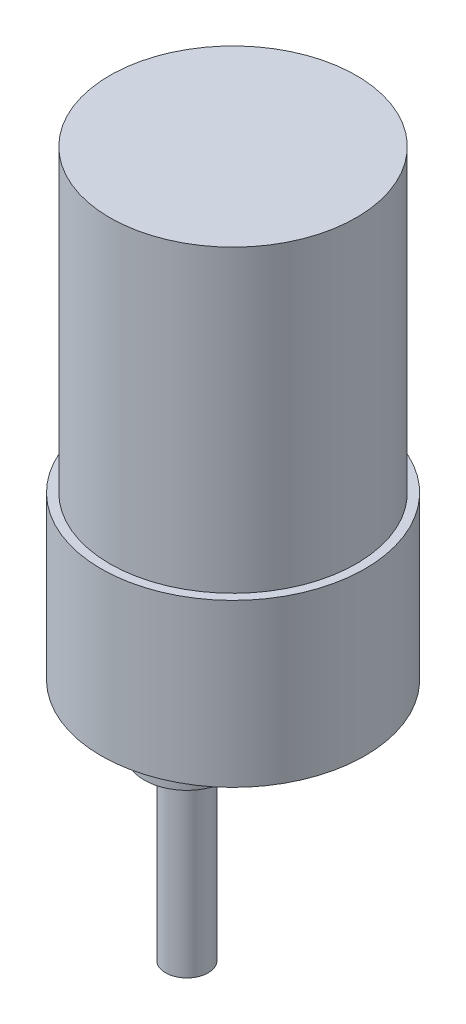
ISO-10303-21;
HEADER;
FILE_DESCRIPTION(('STEP AP214'),'2;1');
FILE_NAME('part.step','',(''),(''),'','','');
FILE_SCHEMA(('AUTOMOTIVE_DESIGN { 1 0 10303 214 1 1 1 1 }'));
ENDSEC;
DATA;
#1=APPLICATION_CONTEXT('core data for automotive mechanical design processes');
#2=APPLICATION_PROTOCOL_DEFINITION('international standard','automotive_design',2000,#1);
#3=PRODUCT_CONTEXT('',#1,'mechanical');
#4=PRODUCT('Part','Part','',(#3));
#5=PRODUCT_RELATED_PRODUCT_CATEGORY('part','',(#4));
#6=PRODUCT_DEFINITION_FORMATION('','',#4);
#7=PRODUCT_DEFINITION_CONTEXT('part definition',#1,'design');
#8=PRODUCT_DEFINITION('design','',#6,#7);
#9=PRODUCT_DEFINITION_SHAPE('','',#8);
#10=(LENGTH_UNIT() NAMED_UNIT(*) SI_UNIT(.MILLI.,.METRE.));
#11=(NAMED_UNIT(*) PLANE_ANGLE_UNIT() SI_UNIT($,.RADIAN.));
#12=(NAMED_UNIT(*) SI_UNIT($,.STERADIAN.) SOLID_ANGLE_UNIT());
#13=UNCERTAINTY_MEASURE_WITH_UNIT(LENGTH_MEASURE(1.E-05),#10,'distance_accuracy_value','');
#14=(GEOMETRIC_REPRESENTATION_CONTEXT(3) GLOBAL_UNCERTAINTY_ASSIGNED_CONTEXT((#13)) GLOBAL_UNIT_ASSIGNED_CONTEXT((#10,
#11,#12)) REPRESENTATION_CONTEXT('',''));
#15=CARTESIAN_POINT('',(0.,0.,0.));
#16=DIRECTION('',(0.,0.,1.));
#17=DIRECTION('',(1.,0.,0.));
#18=AXIS2_PLACEMENT_3D('',#15,#16,#17);
#19=CARTESIAN_POINT('',(0.,0.,0.));
#20=DIRECTION('',(0.,1.,0.));
#21=DIRECTION('',(0.,0.,1.));
#22=AXIS2_PLACEMENT_3D('',#19,#20,#21);
#23=PLANE('',#22);
#24=CARTESIAN_POINT('',(14.,0.,0.));
#25=DIRECTION('',(0.,-1.,0.));
#26=DIRECTION('',(0.,0.,-1.));
#27=AXIS2_PLACEMENT_3D('',#24,#25,#26);
#28=CIRCLE('',#27,1.);
#29=CARTESIAN_POINT('',(14.,0.,-1.));
#30=VERTEX_POINT('',#29);
#31=EDGE_CURVE('E72',#30,#30,#28,.T.);
#32=ORIENTED_EDGE('',*,*,#31,.F.);
#33=EDGE_LOOP('',(#32));
#34=FACE_BOUND('',#33,.T.);
#35=CARTESIAN_POINT('',(0.,0.,6.5));
#36=DIRECTION('',(0.,1.,0.));
#37=DIRECTION('',(0.,0.,1.));
#38=AXIS2_PLACEMENT_3D('',#35,#36,#37);
#39=CIRCLE('',#38,6.);
#40=CARTESIAN_POINT('',(0.,0.,12.5));
#41=VERTEX_POINT('',#40);
#42=EDGE_CURVE('E10',#41,#41,#39,.F.);
#43=ORIENTED_EDGE('',*,*,#42,.F.);
#44=EDGE_LOOP('',(#43));
#45=FACE_BOUND('',#44,.T.);
#46=CARTESIAN_POINT('',(0.,0.,0.));
#47=DIRECTION('',(0.,1.,0.));
#48=DIRECTION('',(0.,0.,1.));
#49=AXIS2_PLACEMENT_3D('',#46,#47,#48);
#50=CIRCLE('',#49,18.575);
#51=CARTESIAN_POINT('',(0.,0.,18.575));
#52=VERTEX_POINT('',#51);
#53=EDGE_CURVE('E44',#52,#52,#50,.T.);
#54=ORIENTED_EDGE('',*,*,#53,.F.);
#55=EDGE_LOOP('',(#54));
#56=FACE_BOUND('',#55,.T.);
#57=CARTESIAN_POINT('',(-14.,0.,0.));
#58=DIRECTION('',(0.,-1.,0.));
#59=DIRECTION('',(0.,0.,-1.));
#60=AXIS2_PLACEMENT_3D('',#57,#58,#59);
#61=CIRCLE('',#60,1.);
#62=CARTESIAN_POINT('',(-14.,0.,-1.));
#63=VERTEX_POINT('',#62);
#64=EDGE_CURVE('E66',#63,#63,#61,.F.);
#65=ORIENTED_EDGE('',*,*,#64,.T.);
#66=EDGE_LOOP('',(#65));
#67=FACE_BOUND('',#66,.T.);
#68=ADVANCED_FACE('F33',(#34,#45,#56,#67),#23,.F.);
#69=CARTESIAN_POINT('',(0.,22.8,0.));
#70=DIRECTION('',(0.,1.,0.));
#71=DIRECTION('',(0.,0.,1.));
#72=AXIS2_PLACEMENT_3D('',#69,#70,#71);
#73=PLANE('',#72);
#74=CARTESIAN_POINT('',(0.,22.8,0.));
#75=DIRECTION('',(0.,1.,0.));
#76=DIRECTION('',(0.,0.,1.));
#77=AXIS2_PLACEMENT_3D('',#74,#75,#76);
#78=CIRCLE('',#77,18.575);
#79=CARTESIAN_POINT('',(0.,22.8,18.575));
#80=VERTEX_POINT('',#79);
#81=EDGE_CURVE('E40',#80,#80,#78,.T.);
#82=ORIENTED_EDGE('',*,*,#81,.T.);
#83=EDGE_LOOP('',(#82));
#84=FACE_BOUND('',#83,.T.);
#85=CARTESIAN_POINT('',(0.,22.8,0.));
#86=DIRECTION('',(0.,1.,0.));
#87=DIRECTION('',(0.,0.,1.));
#88=AXIS2_PLACEMENT_3D('',#85,#86,#87);
#89=CIRCLE('',#88,17.35);
#90=CARTESIAN_POINT('',(0.,22.8,17.35));
#91=VERTEX_POINT('',#90);
#92=EDGE_CURVE('E49',#91,#91,#89,.F.);
#93=ORIENTED_EDGE('',*,*,#92,.T.);
#94=EDGE_LOOP('',(#93));
#95=FACE_BOUND('',#94,.T.);
#96=ADVANCED_FACE('F89',(#84,#95),#73,.T.);
#97=CARTESIAN_POINT('',(0.,22.8,0.));
#98=DIRECTION('',(0.,-1.,0.));
#99=DIRECTION('',(0.,0.,-1.));
#100=AXIS2_PLACEMENT_3D('',#97,#98,#99);
#101=CYLINDRICAL_SURFACE('',#100,18.575);
#102=ORIENTED_EDGE('',*,*,#81,.F.);
#103=EDGE_LOOP('',(#102));
#104=FACE_BOUND('',#103,.T.);
#105=ORIENTED_EDGE('',*,*,#53,.T.);
#106=EDGE_LOOP('',(#105));
#107=FACE_BOUND('',#106,.T.);
#108=ADVANCED_FACE('F35',(#104,#107),#101,.T.);
#109=CARTESIAN_POINT('',(0.,65.,0.));
#110=DIRECTION('',(0.,-1.,0.));
#111=DIRECTION('',(0.,0.,-1.));
#112=AXIS2_PLACEMENT_3D('',#109,#110,#111);
#113=CYLINDRICAL_SURFACE('',#112,17.35);
#114=ORIENTED_EDGE('',*,*,#92,.F.);
#115=EDGE_LOOP('',(#114));
#116=FACE_BOUND('',#115,.T.);
#117=CARTESIAN_POINT('',(0.,65.,0.));
#118=DIRECTION('',(0.,1.,0.));
#119=DIRECTION('',(0.,0.,1.));
#120=AXIS2_PLACEMENT_3D('',#117,#118,#119);
#121=CIRCLE('',#120,17.35);
#122=CARTESIAN_POINT('',(0.,65.,17.35));
#123=VERTEX_POINT('',#122);
#124=EDGE_CURVE('E53',#123,#123,#121,.T.);
#125=ORIENTED_EDGE('',*,*,#124,.F.);
#126=EDGE_LOOP('',(#125));
#127=FACE_BOUND('',#126,.T.);
#128=ADVANCED_FACE('F124',(#116,#127),#113,.T.);
#129=CARTESIAN_POINT('',(0.,65.,0.));
#130=DIRECTION('',(0.,1.,0.));
#131=DIRECTION('',(0.,0.,1.));
#132=AXIS2_PLACEMENT_3D('',#129,#130,#131);
#133=PLANE('',#132);
#134=ORIENTED_EDGE('',*,*,#124,.T.);
#135=EDGE_LOOP('',(#134));
#136=FACE_BOUND('',#135,.T.);
#137=ADVANCED_FACE('F120',(#136),#133,.T.);
#138=CARTESIAN_POINT('',(0.,-6.,6.5));
#139=DIRECTION('',(0.,1.,0.));
#140=DIRECTION('',(0.,0.,1.));
#141=AXIS2_PLACEMENT_3D('',#138,#139,#140);
#142=CYLINDRICAL_SURFACE('',#141,6.);
#143=CARTESIAN_POINT('',(0.,-6.,6.5));
#144=DIRECTION('',(0.,-1.,0.));
#145=DIRECTION('',(0.,0.,-1.));
#146=AXIS2_PLACEMENT_3D('',#143,#144,#145);
#147=CIRCLE('',#146,6.);
#148=CARTESIAN_POINT('',(0.,-6.,0.499999999999999));
#149=VERTEX_POINT('',#148);
#150=EDGE_CURVE('E56',#149,#149,#147,.T.);
#151=ORIENTED_EDGE('',*,*,#150,.F.);
#152=EDGE_LOOP('',(#151));
#153=FACE_BOUND('',#152,.T.);
#154=ORIENTED_EDGE('',*,*,#42,.T.);
#155=EDGE_LOOP('',(#154));
#156=FACE_BOUND('',#155,.T.);
#157=ADVANCED_FACE('F116',(#153,#156),#142,.T.);
#158=CARTESIAN_POINT('',(0.,-6.,0.));
#159=DIRECTION('',(0.,-1.,0.));
#160=DIRECTION('',(0.,0.,-1.));
#161=AXIS2_PLACEMENT_3D('',#158,#159,#160);
#162=PLANE('',#161);
#163=CARTESIAN_POINT('',(0.,-6.,6.5));
#164=DIRECTION('',(0.,-1.,0.));
#165=DIRECTION('',(0.,0.,-1.));
#166=AXIS2_PLACEMENT_3D('',#163,#164,#165);
#167=CIRCLE('',#166,3.);
#168=CARTESIAN_POINT('',(0.,-6.,3.5));
#169=VERTEX_POINT('',#168);
#170=EDGE_CURVE('E59',#169,#169,#167,.T.);
#171=ORIENTED_EDGE('',*,*,#170,.F.);
#172=EDGE_LOOP('',(#171));
#173=FACE_BOUND('',#172,.T.);
#174=ORIENTED_EDGE('',*,*,#150,.T.);
#175=EDGE_LOOP('',(#174));
#176=FACE_BOUND('',#175,.T.);
#177=ADVANCED_FACE('F112',(#173,#176),#162,.T.);
#178=CARTESIAN_POINT('',(0.,-31.,6.5));
#179=DIRECTION('',(0.,1.,0.));
#180=DIRECTION('',(0.,0.,1.));
#181=AXIS2_PLACEMENT_3D('',#178,#179,#180);
#182=CYLINDRICAL_SURFACE('',#181,3.);
#183=ORIENTED_EDGE('',*,*,#170,.T.);
#184=EDGE_LOOP('',(#183));
#185=FACE_BOUND('',#184,.T.);
#186=CARTESIAN_POINT('',(0.,-31.,6.5));
#187=DIRECTION('',(0.,-1.,0.));
#188=DIRECTION('',(0.,0.,-1.));
#189=AXIS2_PLACEMENT_3D('',#186,#187,#188);
#190=CIRCLE('',#189,3.);
#191=CARTESIAN_POINT('',(0.,-31.,3.5));
#192=VERTEX_POINT('',#191);
#193=EDGE_CURVE('E62',#192,#192,#190,.T.);
#194=ORIENTED_EDGE('',*,*,#193,.F.);
#195=EDGE_LOOP('',(#194));
#196=FACE_BOUND('',#195,.T.);
#197=ADVANCED_FACE('F106',(#185,#196),#182,.T.);
#198=CARTESIAN_POINT('',(0.,-31.,0.));
#199=DIRECTION('',(0.,-1.,0.));
#200=DIRECTION('',(0.,0.,-1.));
#201=AXIS2_PLACEMENT_3D('',#198,#199,#200);
#202=PLANE('',#201);
#203=ORIENTED_EDGE('',*,*,#193,.T.);
#204=EDGE_LOOP('',(#203));
#205=FACE_BOUND('',#204,.T.);
#206=ADVANCED_FACE('F97',(#205),#202,.T.);
#207=CARTESIAN_POINT('',(-14.,5.,0.));
#208=DIRECTION('',(0.,-1.,0.));
#209=DIRECTION('',(0.,0.,-1.));
#210=AXIS2_PLACEMENT_3D('',#207,#208,#209);
#211=CYLINDRICAL_SURFACE('',#210,1.);
#212=CARTESIAN_POINT('',(-14.,5.,0.));
#213=DIRECTION('',(0.,-1.,0.));
#214=DIRECTION('',(0.,0.,-1.));
#215=AXIS2_PLACEMENT_3D('',#212,#213,#214);
#216=CIRCLE('',#215,1.);
#217=CARTESIAN_POINT('',(-14.,5.,-1.));
#218=VERTEX_POINT('',#217);
#219=EDGE_CURVE('E65',#218,#218,#216,.F.);
#220=ORIENTED_EDGE('',*,*,#219,.T.);
#221=EDGE_LOOP('',(#220));
#222=FACE_BOUND('',#221,.T.);
#223=ORIENTED_EDGE('',*,*,#64,.F.);
#224=EDGE_LOOP('',(#223));
#225=FACE_BOUND('',#224,.T.);
#226=ADVANCED_FACE('F95',(#222,#225),#211,.F.);
#227=CARTESIAN_POINT('',(0.,5.,0.));
#228=DIRECTION('',(0.,-1.,0.));
#229=DIRECTION('',(0.,0.,-1.));
#230=AXIS2_PLACEMENT_3D('',#227,#228,#229);
#231=PLANE('',#230);
#232=ORIENTED_EDGE('',*,*,#219,.F.);
#233=EDGE_LOOP('',(#232));
#234=FACE_BOUND('',#233,.T.);
#235=ADVANCED_FACE('F83',(#234),#231,.T.);
#236=CARTESIAN_POINT('',(14.,5.,0.));
#237=DIRECTION('',(0.,-1.,0.));
#238=DIRECTION('',(0.,0.,-1.));
#239=AXIS2_PLACEMENT_3D('',#236,#237,#238);
#240=CYLINDRICAL_SURFACE('',#239,1.);
#241=CARTESIAN_POINT('',(14.,5.,0.));
#242=DIRECTION('',(0.,-1.,0.));
#243=DIRECTION('',(0.,0.,-1.));
#244=AXIS2_PLACEMENT_3D('',#241,#242,#243);
#245=CIRCLE('',#244,1.);
#246=CARTESIAN_POINT('',(14.,5.,-1.));
#247=VERTEX_POINT('',#246);
#248=EDGE_CURVE('E69',#247,#247,#245,.T.);
#249=ORIENTED_EDGE('',*,*,#248,.F.);
#250=EDGE_LOOP('',(#249));
#251=FACE_BOUND('',#250,.T.);
#252=ORIENTED_EDGE('',*,*,#31,.T.);
#253=EDGE_LOOP('',(#252));
#254=FACE_BOUND('',#253,.T.);
#255=ADVANCED_FACE('F80',(#251,#254),#240,.F.);
#256=CARTESIAN_POINT('',(0.,5.,0.));
#257=DIRECTION('',(0.,-1.,0.));
#258=DIRECTION('',(0.,0.,-1.));
#259=AXIS2_PLACEMENT_3D('',#256,#257,#258);
#260=PLANE('',#259);
#261=ORIENTED_EDGE('',*,*,#248,.T.);
#262=EDGE_LOOP('',(#261));
#263=FACE_BOUND('',#262,.T.);
#264=ADVANCED_FACE('F78',(#263),#260,.T.);
#265=CLOSED_SHELL('',(#68,#96,#108,#128,#137,#157,#177,#197,#206,#226,#235,#255,#264));
#266=MANIFOLD_SOLID_BREP('B2',#265);
#267=ADVANCED_BREP_SHAPE_REPRESENTATION('',(#18,#266),#14);
#268=SHAPE_DEFINITION_REPRESENTATION(#9,#267);
ENDSEC;
END-ISO-10303-21;
